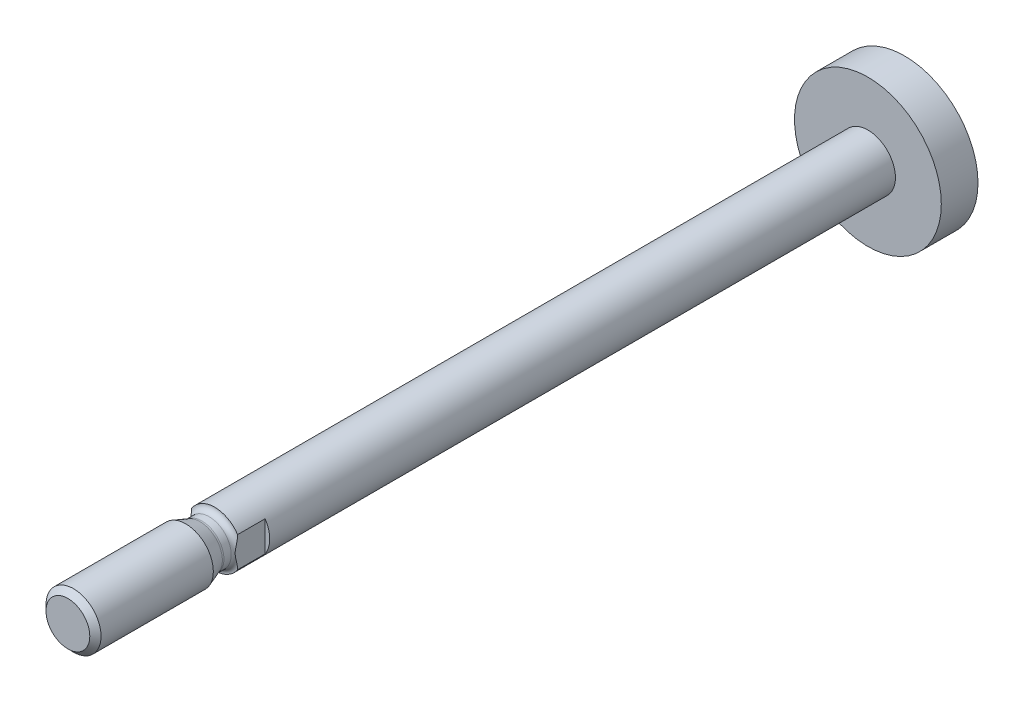
ISO-10303-21;
HEADER;
FILE_DESCRIPTION(('STEP AP214'),'2;1');
FILE_NAME('part.step','',(''),(''),'','','');
FILE_SCHEMA(('AUTOMOTIVE_DESIGN { 1 0 10303 214 1 1 1 1 }'));
ENDSEC;
DATA;
#1=APPLICATION_CONTEXT('core data for automotive mechanical design processes');
#2=APPLICATION_PROTOCOL_DEFINITION('international standard','automotive_design',2000,#1);
#3=PRODUCT_CONTEXT('',#1,'mechanical');
#4=PRODUCT('Part','Part','',(#3));
#5=PRODUCT_RELATED_PRODUCT_CATEGORY('part','',(#4));
#6=PRODUCT_DEFINITION_FORMATION('','',#4);
#7=PRODUCT_DEFINITION_CONTEXT('part definition',#1,'design');
#8=PRODUCT_DEFINITION('design','',#6,#7);
#9=PRODUCT_DEFINITION_SHAPE('','',#8);
#10=(LENGTH_UNIT() NAMED_UNIT(*) SI_UNIT(.MILLI.,.METRE.));
#11=(NAMED_UNIT(*) PLANE_ANGLE_UNIT() SI_UNIT($,.RADIAN.));
#12=(NAMED_UNIT(*) SI_UNIT($,.STERADIAN.) SOLID_ANGLE_UNIT());
#13=UNCERTAINTY_MEASURE_WITH_UNIT(LENGTH_MEASURE(1.E-05),#10,'distance_accuracy_value','');
#14=(GEOMETRIC_REPRESENTATION_CONTEXT(3) GLOBAL_UNCERTAINTY_ASSIGNED_CONTEXT((#13)) GLOBAL_UNIT_ASSIGNED_CONTEXT((#10,
#11,#12)) REPRESENTATION_CONTEXT('',''));
#15=CARTESIAN_POINT('',(0.,0.,0.));
#16=DIRECTION('',(0.,0.,1.));
#17=DIRECTION('',(1.,0.,0.));
#18=AXIS2_PLACEMENT_3D('',#15,#16,#17);
#19=CARTESIAN_POINT('',(-2.5,-5.,6.));
#20=DIRECTION('',(-1.,0.,0.));
#21=DIRECTION('',(0.,-1.,0.));
#22=AXIS2_PLACEMENT_3D('',#19,#20,#21);
#23=PLANE('',#22);
#24=DIRECTION('',(0.,0.,-1.));
#25=VECTOR('',#24,1.);
#26=CARTESIAN_POINT('',(-2.5,1.6583123951777,-70.2));
#27=LINE('',#26,#25);
#28=CARTESIAN_POINT('',(-2.5,1.65831239517778,4.99999999999909));
#29=VERTEX_POINT('',#28);
#30=CARTESIAN_POINT('',(-2.5,1.6583123951777,2.));
#31=VERTEX_POINT('',#30);
#32=EDGE_CURVE('E11',#29,#31,#27,.T.);
#33=ORIENTED_EDGE('',*,*,#32,.T.);
#34=DIRECTION('',(0.,1.,0.));
#35=VECTOR('',#34,1.);
#36=CARTESIAN_POINT('',(-2.5,-5.,2.));
#37=LINE('',#36,#35);
#38=CARTESIAN_POINT('',(-2.5,-1.6583123951777,2.));
#39=VERTEX_POINT('',#38);
#40=EDGE_CURVE('E40',#39,#31,#37,.T.);
#41=ORIENTED_EDGE('',*,*,#40,.F.);
#42=DIRECTION('',(0.,0.,1.));
#43=VECTOR('',#42,1.);
#44=CARTESIAN_POINT('',(-2.5,-1.6583123951777,-70.2));
#45=LINE('',#44,#43);
#46=CARTESIAN_POINT('',(-2.5,-1.6583123951777,5.));
#47=VERTEX_POINT('',#46);
#48=EDGE_CURVE('E27',#39,#47,#45,.T.);
#49=ORIENTED_EDGE('',*,*,#48,.T.);
#50=CARTESIAN_POINT('',(-2.5,-1.6583123951777,5.));
#51=CARTESIAN_POINT('',(-2.5,-1.46288117068297,5.));
#52=CARTESIAN_POINT('',(-2.5,-1.22954580081157,5.03940890434712));
#53=CARTESIAN_POINT('',(-2.5,-1.06405019615094,5.06736009090548));
#54=CARTESIAN_POINT('',(-2.5,-0.80727070460018,5.12994673428533));
#55=CARTESIAN_POINT('',(-2.5,-0.70239350077693,5.15550918132781));
#56=CARTESIAN_POINT('',(-2.5,-0.59755144451285,5.18121540273245));
#57=CARTESIAN_POINT('',(-2.5,-0.49310448692291,5.20682474990211));
#58=CARTESIAN_POINT('',(-2.5,-0.386954526302209,5.22732951261347));
#59=CARTESIAN_POINT('',(-2.5,-0.15305400302122,5.27251158050962));
#60=CARTESIAN_POINT('',(-2.5,0.0406661511011003,5.2678394726732));
#61=CARTESIAN_POINT('',(-2.5,0.2179110997672,5.26356471087889));
#62=CARTESIAN_POINT('',(-2.5,0.44730900901881,5.21559140985227));
#63=CARTESIAN_POINT('',(-2.5,0.52873383897352,5.19856327785576));
#64=CARTESIAN_POINT('',(-2.5,0.64767995439602,5.16942160964469));
#65=CARTESIAN_POINT('',(-2.5,0.74767031607298,5.14492408037319));
#66=CARTESIAN_POINT('',(-2.5,0.84759688758847,5.12016763325622));
#67=CARTESIAN_POINT('',(-2.5,1.01518084504327,5.07864931317918));
#68=CARTESIAN_POINT('',(-2.5,1.1687230909058,5.05009036564464));
#69=CARTESIAN_POINT('',(-2.5,1.43802528517796,5.));
#70=CARTESIAN_POINT('',(-2.5,1.65831239517791,5.));
#71=B_SPLINE_CURVE_WITH_KNOTS('',2,(#50,#51,#52,#53,#54,#55,#56,#57,#58,#59,#60,#61,#62,#63,#64,
#65,#66,#67,#68,#69,#70),.UNSPECIFIED.,.F.,.F.,(3,2,2,2,2,2,2,2,2,2,3),(0.,0.125,0.25,0.3125,
0.375,0.5,0.625,0.6875,0.75,0.85,1.),.UNSPECIFIED.);
#72=EDGE_CURVE('E145',#47,#29,#71,.T.);
#73=ORIENTED_EDGE('',*,*,#72,.T.);
#74=EDGE_LOOP('',(#33,#41,#49,#73));
#75=FACE_BOUND('',#74,.T.);
#76=ADVANCED_FACE('F16',(#75),#23,.T.);
#77=CARTESIAN_POINT('',(2.5,5.,6.));
#78=DIRECTION('',(1.,0.,0.));
#79=DIRECTION('',(0.,0.,1.));
#80=AXIS2_PLACEMENT_3D('',#77,#78,#79);
#81=PLANE('',#80);
#82=DIRECTION('',(0.,0.,-1.));
#83=VECTOR('',#82,1.);
#84=CARTESIAN_POINT('',(2.5,-1.6583123951777,-70.2));
#85=LINE('',#84,#83);
#86=CARTESIAN_POINT('',(2.5,-1.65831239517778,4.99999999999909));
#87=VERTEX_POINT('',#86);
#88=CARTESIAN_POINT('',(2.5,-1.6583123951777,2.));
#89=VERTEX_POINT('',#88);
#90=EDGE_CURVE('E115',#87,#89,#85,.T.);
#91=ORIENTED_EDGE('',*,*,#90,.T.);
#92=DIRECTION('',(0.,-1.,0.));
#93=VECTOR('',#92,1.);
#94=CARTESIAN_POINT('',(2.5,5.,2.));
#95=LINE('',#94,#93);
#96=CARTESIAN_POINT('',(2.5,1.6583123951777,2.));
#97=VERTEX_POINT('',#96);
#98=EDGE_CURVE('E109',#97,#89,#95,.T.);
#99=ORIENTED_EDGE('',*,*,#98,.F.);
#100=DIRECTION('',(0.,0.,1.));
#101=VECTOR('',#100,1.);
#102=CARTESIAN_POINT('',(2.5,1.6583123951777,-70.2));
#103=LINE('',#102,#101);
#104=CARTESIAN_POINT('',(2.5,1.6583123951777,5.));
#105=VERTEX_POINT('',#104);
#106=EDGE_CURVE('E112',#97,#105,#103,.T.);
#107=ORIENTED_EDGE('',*,*,#106,.T.);
#108=CARTESIAN_POINT('',(2.5,1.6583123951777,5.));
#109=CARTESIAN_POINT('',(2.5,1.46288117068297,5.));
#110=CARTESIAN_POINT('',(2.5,1.22954580081157,5.03940890434712));
#111=CARTESIAN_POINT('',(2.5,1.06405019615094,5.06736009090548));
#112=CARTESIAN_POINT('',(2.5,0.80727070460018,5.12994673428533));
#113=CARTESIAN_POINT('',(2.5,0.70239350077693,5.15550918132781));
#114=CARTESIAN_POINT('',(2.5,0.59755144451285,5.18121540273245));
#115=CARTESIAN_POINT('',(2.5,0.49310448692291,5.20682474990211));
#116=CARTESIAN_POINT('',(2.5,0.386954526302209,5.22732951261347));
#117=CARTESIAN_POINT('',(2.5,0.15305400302122,5.27251158050962));
#118=CARTESIAN_POINT('',(2.5,-0.0406661511011003,5.2678394726732));
#119=CARTESIAN_POINT('',(2.5,-0.2179110997672,5.26356471087889));
#120=CARTESIAN_POINT('',(2.5,-0.44730900901881,5.21559140985227));
#121=CARTESIAN_POINT('',(2.5,-0.52873383897352,5.19856327785576));
#122=CARTESIAN_POINT('',(2.5,-0.64767995439602,5.16942160964469));
#123=CARTESIAN_POINT('',(2.5,-0.74767031607298,5.14492408037319));
#124=CARTESIAN_POINT('',(2.5,-0.84759688758847,5.12016763325622));
#125=CARTESIAN_POINT('',(2.5,-1.01518084504327,5.07864931317918));
#126=CARTESIAN_POINT('',(2.5,-1.1687230909058,5.05009036564464));
#127=CARTESIAN_POINT('',(2.5,-1.43802528517796,5.));
#128=CARTESIAN_POINT('',(2.5,-1.65831239517791,5.));
#129=B_SPLINE_CURVE_WITH_KNOTS('',2,(#108,#109,#110,#111,#112,#113,#114,#115,#116,#117,#118,
#119,#120,#121,#122,#123,#124,#125,#126,#127,#128),.UNSPECIFIED.,.F.,.F.,(3,2,2,2,2,2,2,2,2,2,
3),(0.,0.125,0.25,0.3125,0.375,0.5,0.625,0.6875,0.75,0.85,1.),.UNSPECIFIED.);
#130=EDGE_CURVE('E130',#105,#87,#129,.T.);
#131=ORIENTED_EDGE('',*,*,#130,.T.);
#132=EDGE_LOOP('',(#91,#99,#107,#131));
#133=FACE_BOUND('',#132,.T.);
#134=ADVANCED_FACE('F111',(#133),#81,.T.);
#135=CARTESIAN_POINT('',(0.,0.,2.));
#136=DIRECTION('',(0.,0.,1.));
#137=DIRECTION('',(-1.,0.,0.));
#138=AXIS2_PLACEMENT_3D('',#135,#136,#137);
#139=PLANE('',#138);
#140=CARTESIAN_POINT('',(0.,0.,2.));
#141=DIRECTION('',(0.,0.,1.));
#142=DIRECTION('',(-1.,0.,0.));
#143=AXIS2_PLACEMENT_3D('',#140,#141,#142);
#144=CIRCLE('',#143,3.);
#145=EDGE_CURVE('E120',#89,#97,#144,.T.);
#146=ORIENTED_EDGE('',*,*,#145,.T.);
#147=ORIENTED_EDGE('',*,*,#98,.T.);
#148=EDGE_LOOP('',(#146,#147));
#149=FACE_BOUND('',#148,.T.);
#150=ADVANCED_FACE('F18',(#149),#139,.T.);
#151=CARTESIAN_POINT('',(0.,0.,-70.2));
#152=DIRECTION('',(0.,0.,1.));
#153=DIRECTION('',(1.,0.,0.));
#154=AXIS2_PLACEMENT_3D('',#151,#152,#153);
#155=CYLINDRICAL_SURFACE('',#154,3.);
#156=ORIENTED_EDGE('',*,*,#90,.F.);
#157=CARTESIAN_POINT('',(0.,0.,5.));
#158=DIRECTION('',(0.,0.,-1.));
#159=DIRECTION('',(1.,0.,0.));
#160=AXIS2_PLACEMENT_3D('',#157,#158,#159);
#161=CIRCLE('',#160,3.);
#162=EDGE_CURVE('E121',#87,#47,#161,.T.);
#163=ORIENTED_EDGE('',*,*,#162,.T.);
#164=ORIENTED_EDGE('',*,*,#48,.F.);
#165=CARTESIAN_POINT('',(0.,0.,2.));
#166=DIRECTION('',(0.,0.,1.));
#167=DIRECTION('',(-1.,0.,0.));
#168=AXIS2_PLACEMENT_3D('',#165,#166,#167);
#169=CIRCLE('',#168,3.);
#170=EDGE_CURVE('E236',#31,#39,#169,.T.);
#171=ORIENTED_EDGE('',*,*,#170,.F.);
#172=ORIENTED_EDGE('',*,*,#32,.F.);
#173=CARTESIAN_POINT('',(0.,0.,5.));
#174=DIRECTION('',(0.,0.,-1.));
#175=DIRECTION('',(1.,0.,0.));
#176=AXIS2_PLACEMENT_3D('',#173,#174,#175);
#177=CIRCLE('',#176,3.);
#178=EDGE_CURVE('E128',#29,#105,#177,.T.);
#179=ORIENTED_EDGE('',*,*,#178,.T.);
#180=ORIENTED_EDGE('',*,*,#106,.F.);
#181=ORIENTED_EDGE('',*,*,#145,.F.);
#182=EDGE_LOOP('',(#156,#163,#164,#171,#172,#179,#180,#181));
#183=FACE_BOUND('',#182,.T.);
#184=CARTESIAN_POINT('',(0.,0.,-66.2));
#185=DIRECTION('',(0.,0.,-1.));
#186=DIRECTION('',(1.,0.,0.));
#187=AXIS2_PLACEMENT_3D('',#184,#185,#186);
#188=CIRCLE('',#187,3.);
#189=CARTESIAN_POINT('',(3.,0.,-66.2));
#190=VERTEX_POINT('',#189);
#191=EDGE_CURVE('E220',#190,#190,#188,.T.);
#192=ORIENTED_EDGE('',*,*,#191,.F.);
#193=EDGE_LOOP('',(#192));
#194=FACE_BOUND('',#193,.T.);
#195=ADVANCED_FACE('F124',(#183,#194),#155,.T.);
#196=CARTESIAN_POINT('',(0.,0.,5.6));
#197=DIRECTION('',(0.,0.,-1.));
#198=DIRECTION('',(1.,0.,0.));
#199=AXIS2_PLACEMENT_3D('',#196,#197,#198);
#200=TOROIDAL_SURFACE('',#199,3.,0.6);
#201=CARTESIAN_POINT('',(0.,0.,5.6));
#202=DIRECTION('',(0.,0.,-1.));
#203=DIRECTION('',(1.,0.,0.));
#204=AXIS2_PLACEMENT_3D('',#201,#202,#203);
#205=CIRCLE('',#204,2.4);
#206=CARTESIAN_POINT('',(2.4,0.,5.6));
#207=VERTEX_POINT('',#206);
#208=EDGE_CURVE('E215',#207,#207,#205,.T.);
#209=ORIENTED_EDGE('',*,*,#208,.T.);
#210=EDGE_LOOP('',(#209));
#211=FACE_BOUND('',#210,.T.);
#212=ORIENTED_EDGE('',*,*,#162,.F.);
#213=ORIENTED_EDGE('',*,*,#130,.F.);
#214=ORIENTED_EDGE('',*,*,#178,.F.);
#215=ORIENTED_EDGE('',*,*,#72,.F.);
#216=EDGE_LOOP('',(#212,#213,#214,#215));
#217=FACE_BOUND('',#216,.T.);
#218=ADVANCED_FACE('F181',(#211,#217),#200,.F.);
#219=CARTESIAN_POINT('',(0.,-3.,-66.2));
#220=DIRECTION('',(0.,0.,-1.));
#221=DIRECTION('',(0.,1.,0.));
#222=AXIS2_PLACEMENT_3D('',#219,#220,#221);
#223=PLANE('',#222);
#224=CARTESIAN_POINT('',(0.,0.,-66.2));
#225=DIRECTION('',(0.,0.,-1.));
#226=DIRECTION('',(1.,0.,0.));
#227=AXIS2_PLACEMENT_3D('',#224,#225,#226);
#228=CIRCLE('',#227,8.);
#229=CARTESIAN_POINT('',(8.,0.,-66.2));
#230=VERTEX_POINT('',#229);
#231=EDGE_CURVE('E94',#230,#230,#228,.T.);
#232=ORIENTED_EDGE('',*,*,#231,.F.);
#233=EDGE_LOOP('',(#232));
#234=FACE_BOUND('',#233,.T.);
#235=ORIENTED_EDGE('',*,*,#191,.T.);
#236=EDGE_LOOP('',(#235));
#237=FACE_BOUND('',#236,.T.);
#238=ADVANCED_FACE('F191',(#234,#237),#223,.F.);
#239=CARTESIAN_POINT('',(0.,0.,-70.2));
#240=DIRECTION('',(0.,0.,1.));
#241=DIRECTION('',(1.,0.,0.));
#242=AXIS2_PLACEMENT_3D('',#239,#240,#241);
#243=CYLINDRICAL_SURFACE('',#242,8.);
#244=ORIENTED_EDGE('',*,*,#231,.T.);
#245=EDGE_LOOP('',(#244));
#246=FACE_BOUND('',#245,.T.);
#247=CARTESIAN_POINT('',(0.,0.,-70.2));
#248=DIRECTION('',(0.,0.,-1.));
#249=DIRECTION('',(1.,0.,0.));
#250=AXIS2_PLACEMENT_3D('',#247,#248,#249);
#251=CIRCLE('',#250,8.);
#252=CARTESIAN_POINT('',(8.,0.,-70.2));
#253=VERTEX_POINT('',#252);
#254=EDGE_CURVE('E103',#253,#253,#251,.T.);
#255=ORIENTED_EDGE('',*,*,#254,.F.);
#256=EDGE_LOOP('',(#255));
#257=FACE_BOUND('',#256,.T.);
#258=ADVANCED_FACE('F263',(#246,#257),#243,.T.);
#259=CARTESIAN_POINT('',(0.,-8.,-70.2));
#260=DIRECTION('',(0.,0.,1.));
#261=DIRECTION('',(-1.,0.,0.));
#262=AXIS2_PLACEMENT_3D('',#259,#260,#261);
#263=PLANE('',#262);
#264=ORIENTED_EDGE('',*,*,#254,.T.);
#265=EDGE_LOOP('',(#264));
#266=FACE_BOUND('',#265,.T.);
#267=ADVANCED_FACE('F265',(#266),#263,.F.);
#268=CARTESIAN_POINT('',(0.,0.,21.));
#269=DIRECTION('',(0.,0.,-1.));
#270=DIRECTION('',(0.,1.,0.));
#271=AXIS2_PLACEMENT_3D('',#268,#269,#270);
#272=PLANE('',#271);
#273=CARTESIAN_POINT('',(0.,0.,21.));
#274=DIRECTION('',(0.,0.,-1.));
#275=DIRECTION('',(1.,0.,0.));
#276=AXIS2_PLACEMENT_3D('',#273,#274,#275);
#277=CIRCLE('',#276,2.3865);
#278=CARTESIAN_POINT('',(2.3865,0.,21.));
#279=VERTEX_POINT('',#278);
#280=EDGE_CURVE('E231',#279,#279,#277,.T.);
#281=ORIENTED_EDGE('',*,*,#280,.F.);
#282=EDGE_LOOP('',(#281));
#283=FACE_BOUND('',#282,.T.);
#284=ADVANCED_FACE('F272',(#283),#272,.F.);
#285=CARTESIAN_POINT('',(0.,0.,21.));
#286=DIRECTION('',(0.,0.,-1.));
#287=DIRECTION('',(1.,0.,0.));
#288=AXIS2_PLACEMENT_3D('',#285,#286,#287);
#289=CONICAL_SURFACE('',#288,2.3865,0.785398163397446);
#290=CARTESIAN_POINT('',(0.,0.,20.3865));
#291=DIRECTION('',(0.,0.,-1.));
#292=DIRECTION('',(1.,0.,0.));
#293=AXIS2_PLACEMENT_3D('',#290,#291,#292);
#294=CIRCLE('',#293,3.);
#295=CARTESIAN_POINT('',(3.,0.,20.3865));
#296=VERTEX_POINT('',#295);
#297=EDGE_CURVE('E229',#296,#296,#294,.T.);
#298=ORIENTED_EDGE('',*,*,#297,.F.);
#299=EDGE_LOOP('',(#298));
#300=FACE_BOUND('',#299,.T.);
#301=ORIENTED_EDGE('',*,*,#280,.T.);
#302=EDGE_LOOP('',(#301));
#303=FACE_BOUND('',#302,.T.);
#304=ADVANCED_FACE('F276',(#300,#303),#289,.T.);
#305=CARTESIAN_POINT('',(0.,0.,4.));
#306=DIRECTION('',(0.,0.,1.));
#307=DIRECTION('',(1.,0.,0.));
#308=AXIS2_PLACEMENT_3D('',#305,#306,#307);
#309=CYLINDRICAL_SURFACE('',#308,3.);
#310=ORIENTED_EDGE('',*,*,#297,.T.);
#311=EDGE_LOOP('',(#310));
#312=FACE_BOUND('',#311,.T.);
#313=CARTESIAN_POINT('',(0.,0.,8.14848645167277));
#314=DIRECTION('',(0.,0.,-1.));
#315=DIRECTION('',(1.,0.,0.));
#316=AXIS2_PLACEMENT_3D('',#313,#314,#315);
#317=CIRCLE('',#316,3.);
#318=CARTESIAN_POINT('',(3.,0.,8.14848645167277));
#319=VERTEX_POINT('',#318);
#320=EDGE_CURVE('E238',#319,#319,#317,.T.);
#321=ORIENTED_EDGE('',*,*,#320,.F.);
#322=EDGE_LOOP('',(#321));
#323=FACE_BOUND('',#322,.T.);
#324=ADVANCED_FACE('F294',(#312,#323),#309,.T.);
#325=CARTESIAN_POINT('',(0.,0.,8.14848645167277));
#326=DIRECTION('',(0.,0.,1.));
#327=DIRECTION('',(-1.,0.,0.));
#328=AXIS2_PLACEMENT_3D('',#325,#326,#327);
#329=CONICAL_SURFACE('',#328,3.,0.349065850398866);
#330=ORIENTED_EDGE('',*,*,#320,.T.);
#331=EDGE_LOOP('',(#330));
#332=FACE_BOUND('',#331,.T.);
#333=CARTESIAN_POINT('',(0.,0.,6.59941589757032));
#334=DIRECTION('',(0.,0.,-1.));
#335=DIRECTION('',(1.,0.,0.));
#336=AXIS2_PLACEMENT_3D('',#333,#334,#335);
#337=CIRCLE('',#336,2.43618442752846);
#338=CARTESIAN_POINT('',(2.43618442752846,0.,6.59941589757032));
#339=VERTEX_POINT('',#338);
#340=EDGE_CURVE('E241',#339,#339,#337,.T.);
#341=ORIENTED_EDGE('',*,*,#340,.F.);
#342=EDGE_LOOP('',(#341));
#343=FACE_BOUND('',#342,.T.);
#344=ADVANCED_FACE('F286',(#332,#343),#329,.T.);
#345=CARTESIAN_POINT('',(0.,0.,6.39420381157491));
#346=DIRECTION('',(0.,0.,-1.));
#347=DIRECTION('',(1.,0.,0.));
#348=AXIS2_PLACEMENT_3D('',#345,#346,#347);
#349=TOROIDAL_SURFACE('',#348,3.,0.600000000000028);
#350=ORIENTED_EDGE('',*,*,#340,.T.);
#351=EDGE_LOOP('',(#350));
#352=FACE_BOUND('',#351,.T.);
#353=CARTESIAN_POINT('',(0.,0.,6.39420381157491));
#354=DIRECTION('',(0.,0.,-1.));
#355=DIRECTION('',(1.,0.,0.));
#356=AXIS2_PLACEMENT_3D('',#353,#354,#355);
#357=CIRCLE('',#356,2.4);
#358=CARTESIAN_POINT('',(2.4,0.,6.39420381157491));
#359=VERTEX_POINT('',#358);
#360=EDGE_CURVE('E140',#359,#359,#357,.T.);
#361=ORIENTED_EDGE('',*,*,#360,.F.);
#362=EDGE_LOOP('',(#361));
#363=FACE_BOUND('',#362,.T.);
#364=ADVANCED_FACE('F161',(#352,#363),#349,.F.);
#365=CARTESIAN_POINT('',(0.,0.,4.));
#366=DIRECTION('',(0.,0.,1.));
#367=DIRECTION('',(1.,0.,0.));
#368=AXIS2_PLACEMENT_3D('',#365,#366,#367);
#369=CYLINDRICAL_SURFACE('',#368,2.4);
#370=ORIENTED_EDGE('',*,*,#360,.T.);
#371=EDGE_LOOP('',(#370));
#372=FACE_BOUND('',#371,.T.);
#373=ORIENTED_EDGE('',*,*,#208,.F.);
#374=EDGE_LOOP('',(#373));
#375=FACE_BOUND('',#374,.T.);
#376=ADVANCED_FACE('F278',(#372,#375),#369,.T.);
#377=CARTESIAN_POINT('',(0.,0.,2.));
#378=DIRECTION('',(0.,0.,1.));
#379=DIRECTION('',(-1.,0.,0.));
#380=AXIS2_PLACEMENT_3D('',#377,#378,#379);
#381=PLANE('',#380);
#382=ORIENTED_EDGE('',*,*,#170,.T.);
#383=ORIENTED_EDGE('',*,*,#40,.T.);
#384=EDGE_LOOP('',(#382,#383));
#385=FACE_BOUND('',#384,.T.);
#386=ADVANCED_FACE('F280',(#385),#381,.T.);
#387=CLOSED_SHELL('',(#76,#134,#150,#195,#218,#238,#258,#267,#284,#304,#324,#344,#364,#376,#386));
#388=MANIFOLD_SOLID_BREP('B1',#387);
#389=ADVANCED_BREP_SHAPE_REPRESENTATION('',(#18,#388),#14);
#390=SHAPE_DEFINITION_REPRESENTATION(#9,#389);
ENDSEC;
END-ISO-10303-21;
